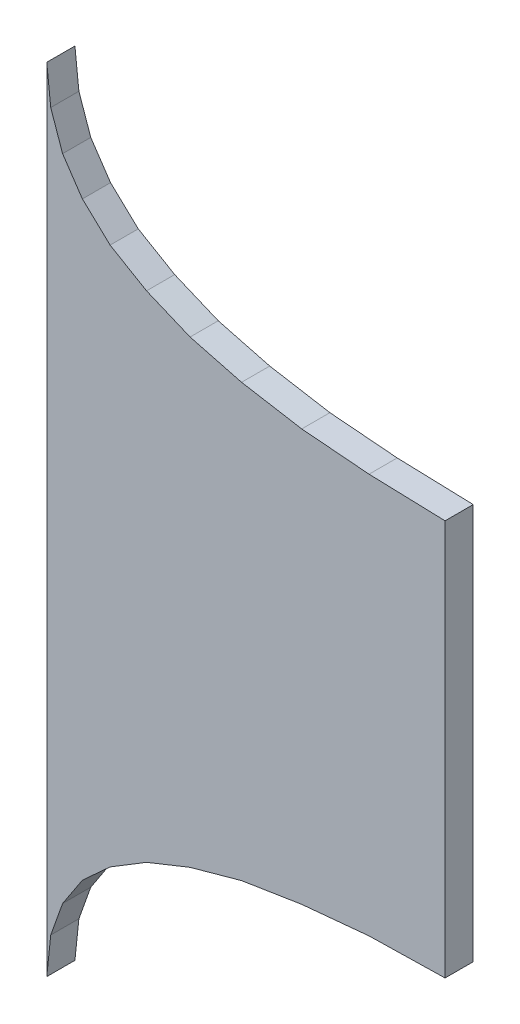
ISO-10303-21;
HEADER;
FILE_DESCRIPTION(('STEP AP214'),'2;1');
FILE_NAME('part.step','',(''),(''),'','','');
FILE_SCHEMA(('AUTOMOTIVE_DESIGN { 1 0 10303 214 1 1 1 1 }'));
ENDSEC;
DATA;
#1=APPLICATION_CONTEXT('core data for automotive mechanical design processes');
#2=APPLICATION_PROTOCOL_DEFINITION('international standard','automotive_design',2000,#1);
#3=PRODUCT_CONTEXT('',#1,'mechanical');
#4=PRODUCT('Part','Part','',(#3));
#5=PRODUCT_RELATED_PRODUCT_CATEGORY('part','',(#4));
#6=PRODUCT_DEFINITION_FORMATION('','',#4);
#7=PRODUCT_DEFINITION_CONTEXT('part definition',#1,'design');
#8=PRODUCT_DEFINITION('design','',#6,#7);
#9=PRODUCT_DEFINITION_SHAPE('','',#8);
#10=(LENGTH_UNIT() NAMED_UNIT(*) SI_UNIT(.MILLI.,.METRE.));
#11=(NAMED_UNIT(*) PLANE_ANGLE_UNIT() SI_UNIT($,.RADIAN.));
#12=(NAMED_UNIT(*) SI_UNIT($,.STERADIAN.) SOLID_ANGLE_UNIT());
#13=UNCERTAINTY_MEASURE_WITH_UNIT(LENGTH_MEASURE(1.E-05),#10,'distance_accuracy_value','');
#14=(GEOMETRIC_REPRESENTATION_CONTEXT(3) GLOBAL_UNCERTAINTY_ASSIGNED_CONTEXT((#13)) GLOBAL_UNIT_ASSIGNED_CONTEXT((#10,
#11,#12)) REPRESENTATION_CONTEXT('',''));
#15=CARTESIAN_POINT('',(0.,0.,0.));
#16=DIRECTION('',(0.,0.,1.));
#17=DIRECTION('',(1.,0.,0.));
#18=AXIS2_PLACEMENT_3D('',#15,#16,#17);
#19=CARTESIAN_POINT('',(37.2039985656738,68.6500015258789,0.));
#20=DIRECTION('',(-0.0312186325311308,-0.99951257970217,0.));
#21=DIRECTION('',(-0.99951257970217,0.0312186325311308,0.));
#22=AXIS2_PLACEMENT_3D('',#19,#20,#21);
#23=PLANE('',#22);
#24=DIRECTION('',(-0.99951257970217,0.0312186325311308,0.));
#25=VECTOR('',#24,1.);
#26=CARTESIAN_POINT('',(37.2039985656738,68.6500015258789,0.03556));
#27=LINE('',#26,#25);
#28=CARTESIAN_POINT('',(37.2039985656738,68.6500015258789,0.03556));
#29=VERTEX_POINT('',#28);
#30=CARTESIAN_POINT('',(37.1080017089844,68.6529998779297,0.03556));
#31=VERTEX_POINT('',#30);
#32=EDGE_CURVE('E11',#29,#31,#27,.T.);
#33=ORIENTED_EDGE('',*,*,#32,.F.);
#34=DIRECTION('',(0.,0.,1.));
#35=VECTOR('',#34,1.);
#36=CARTESIAN_POINT('',(37.2039985656738,68.6500015258789,0.));
#37=LINE('',#36,#35);
#38=CARTESIAN_POINT('',(37.2039985656738,68.6500015258789,0.));
#39=VERTEX_POINT('',#38);
#40=EDGE_CURVE('E24',#39,#29,#37,.T.);
#41=ORIENTED_EDGE('',*,*,#40,.F.);
#42=DIRECTION('',(-0.99951257970217,0.0312186325311308,0.));
#43=VECTOR('',#42,1.);
#44=CARTESIAN_POINT('',(37.2039985656738,68.6500015258789,0.));
#45=LINE('',#44,#43);
#46=CARTESIAN_POINT('',(37.1080017089844,68.6529998779297,0.));
#47=VERTEX_POINT('',#46);
#48=EDGE_CURVE('E184',#39,#47,#45,.T.);
#49=ORIENTED_EDGE('',*,*,#48,.T.);
#50=DIRECTION('',(0.,0.,1.));
#51=VECTOR('',#50,1.);
#52=CARTESIAN_POINT('',(37.1080017089844,68.6529998779297,0.));
#53=LINE('',#52,#51);
#54=EDGE_CURVE('E37',#47,#31,#53,.T.);
#55=ORIENTED_EDGE('',*,*,#54,.T.);
#56=EDGE_LOOP('',(#33,#41,#49,#55));
#57=FACE_BOUND('',#56,.T.);
#58=ADVANCED_FACE('F17',(#57),#23,.F.);
#59=CARTESIAN_POINT('',(37.1080017089844,68.6529998779297,0.));
#60=DIRECTION('',(-0.0821163830411665,-0.996622746898864,0.));
#61=DIRECTION('',(-0.996622746898864,0.0821163830411665,0.));
#62=AXIS2_PLACEMENT_3D('',#59,#60,#61);
#63=PLANE('',#62);
#64=DIRECTION('',(-0.996622746898864,0.0821163830411665,0.));
#65=VECTOR('',#64,1.);
#66=CARTESIAN_POINT('',(37.1080017089844,68.6529998779297,0.03556));
#67=LINE('',#66,#65);
#68=CARTESIAN_POINT('',(37.0229988098144,68.6600036621094,0.03556));
#69=VERTEX_POINT('',#68);
#70=EDGE_CURVE('E336',#31,#69,#67,.T.);
#71=ORIENTED_EDGE('',*,*,#70,.F.);
#72=ORIENTED_EDGE('',*,*,#54,.F.);
#73=DIRECTION('',(-0.996622746898864,0.0821163830411665,0.));
#74=VECTOR('',#73,1.);
#75=CARTESIAN_POINT('',(37.1080017089844,68.6529998779297,0.));
#76=LINE('',#75,#74);
#77=CARTESIAN_POINT('',(37.0229988098144,68.6600036621094,0.));
#78=VERTEX_POINT('',#77);
#79=EDGE_CURVE('E333',#47,#78,#76,.T.);
#80=ORIENTED_EDGE('',*,*,#79,.T.);
#81=DIRECTION('',(0.,0.,1.));
#82=VECTOR('',#81,1.);
#83=CARTESIAN_POINT('',(37.0229988098144,68.6600036621094,0.));
#84=LINE('',#83,#82);
#85=EDGE_CURVE('E331',#78,#69,#84,.T.);
#86=ORIENTED_EDGE('',*,*,#85,.T.);
#87=EDGE_LOOP('',(#71,#72,#80,#86));
#88=FACE_BOUND('',#87,.T.);
#89=ADVANCED_FACE('F344',(#88),#63,.F.);
#90=CARTESIAN_POINT('',(37.0229988098144,68.6600036621094,0.));
#91=DIRECTION('',(-0.168513378631636,-0.985699366552577,0.));
#92=DIRECTION('',(-0.985699366552577,0.168513378631636,0.));
#93=AXIS2_PLACEMENT_3D('',#90,#91,#92);
#94=PLANE('',#93);
#95=DIRECTION('',(-0.985699366552577,0.168513378631636,0.));
#96=VECTOR('',#95,1.);
#97=CARTESIAN_POINT('',(37.0229988098144,68.6600036621094,0.03556));
#98=LINE('',#97,#96);
#99=CARTESIAN_POINT('',(36.9469985961914,68.6729965209961,0.03556));
#100=VERTEX_POINT('',#99);
#101=EDGE_CURVE('E328',#69,#100,#98,.T.);
#102=ORIENTED_EDGE('',*,*,#101,.F.);
#103=ORIENTED_EDGE('',*,*,#85,.F.);
#104=DIRECTION('',(-0.985699366552577,0.168513378631636,0.));
#105=VECTOR('',#104,1.);
#106=CARTESIAN_POINT('',(37.0229988098144,68.6600036621094,0.));
#107=LINE('',#106,#105);
#108=CARTESIAN_POINT('',(36.9469985961914,68.6729965209961,0.));
#109=VERTEX_POINT('',#108);
#110=EDGE_CURVE('E325',#78,#109,#107,.T.);
#111=ORIENTED_EDGE('',*,*,#110,.T.);
#112=DIRECTION('',(0.,0.,1.));
#113=VECTOR('',#112,1.);
#114=CARTESIAN_POINT('',(36.9469985961914,68.6729965209961,0.));
#115=LINE('',#114,#113);
#116=EDGE_CURVE('E323',#109,#100,#115,.T.);
#117=ORIENTED_EDGE('',*,*,#116,.T.);
#118=EDGE_LOOP('',(#102,#103,#111,#117));
#119=FACE_BOUND('',#118,.T.);
#120=ADVANCED_FACE('F350',(#119),#94,.F.);
#121=CARTESIAN_POINT('',(36.9469985961914,68.6729965209961,0.));
#122=DIRECTION('',(-0.253115224368057,-0.967436139077463,0.));
#123=DIRECTION('',(-0.967436139077463,0.253115224368057,0.));
#124=AXIS2_PLACEMENT_3D('',#121,#122,#123);
#125=PLANE('',#124);
#126=DIRECTION('',(-0.967436139077463,0.253115224368057,0.));
#127=VECTOR('',#126,1.);
#128=CARTESIAN_POINT('',(36.9469985961914,68.6729965209961,0.03556));
#129=LINE('',#128,#127);
#130=CARTESIAN_POINT('',(36.8819999694824,68.6900024414063,0.03556));
#131=VERTEX_POINT('',#130);
#132=EDGE_CURVE('E320',#100,#131,#129,.T.);
#133=ORIENTED_EDGE('',*,*,#132,.F.);
#134=ORIENTED_EDGE('',*,*,#116,.F.);
#135=DIRECTION('',(-0.967436139077463,0.253115224368057,0.));
#136=VECTOR('',#135,1.);
#137=CARTESIAN_POINT('',(36.9469985961914,68.6729965209961,0.));
#138=LINE('',#137,#136);
#139=CARTESIAN_POINT('',(36.8819999694824,68.6900024414063,0.));
#140=VERTEX_POINT('',#139);
#141=EDGE_CURVE('E317',#109,#140,#138,.T.);
#142=ORIENTED_EDGE('',*,*,#141,.T.);
#143=DIRECTION('',(0.,0.,1.));
#144=VECTOR('',#143,1.);
#145=CARTESIAN_POINT('',(36.8819999694824,68.6900024414063,0.));
#146=LINE('',#145,#144);
#147=EDGE_CURVE('E315',#140,#131,#146,.T.);
#148=ORIENTED_EDGE('',*,*,#147,.T.);
#149=EDGE_LOOP('',(#133,#134,#142,#148));
#150=FACE_BOUND('',#149,.T.);
#151=ADVANCED_FACE('F352',(#150),#125,.F.);
#152=CARTESIAN_POINT('',(36.8819999694824,68.6900024414063,0.));
#153=DIRECTION('',(-0.385732848397657,-0.922610518944495,0.));
#154=DIRECTION('',(-0.922610518944495,0.385732848397657,0.));
#155=AXIS2_PLACEMENT_3D('',#152,#153,#154);
#156=PLANE('',#155);
#157=DIRECTION('',(-0.922610518944495,0.385732848397657,0.));
#158=VECTOR('',#157,1.);
#159=CARTESIAN_POINT('',(36.8819999694824,68.6900024414063,0.03556));
#160=LINE('',#159,#158);
#161=CARTESIAN_POINT('',(36.8269996643066,68.7129974365234,0.03556));
#162=VERTEX_POINT('',#161);
#163=EDGE_CURVE('E312',#131,#162,#160,.T.);
#164=ORIENTED_EDGE('',*,*,#163,.F.);
#165=ORIENTED_EDGE('',*,*,#147,.F.);
#166=DIRECTION('',(-0.922610518944495,0.385732848397657,0.));
#167=VECTOR('',#166,1.);
#168=CARTESIAN_POINT('',(36.8819999694824,68.6900024414063,0.));
#169=LINE('',#168,#167);
#170=CARTESIAN_POINT('',(36.8269996643066,68.7129974365234,0.));
#171=VERTEX_POINT('',#170);
#172=EDGE_CURVE('E309',#140,#171,#169,.T.);
#173=ORIENTED_EDGE('',*,*,#172,.T.);
#174=DIRECTION('',(0.,0.,1.));
#175=VECTOR('',#174,1.);
#176=CARTESIAN_POINT('',(36.8269996643066,68.7129974365234,0.));
#177=LINE('',#176,#175);
#178=EDGE_CURVE('E307',#171,#162,#177,.T.);
#179=ORIENTED_EDGE('',*,*,#178,.T.);
#180=EDGE_LOOP('',(#164,#165,#173,#179));
#181=FACE_BOUND('',#180,.T.);
#182=ADVANCED_FACE('F357',(#181),#156,.F.);
#183=CARTESIAN_POINT('',(36.8269996643066,68.7129974365234,0.));
#184=DIRECTION('',(-0.506194787091162,-0.862419177385182,0.));
#185=DIRECTION('',(-0.862419177385182,0.506194787091162,0.));
#186=AXIS2_PLACEMENT_3D('',#183,#184,#185);
#187=PLANE('',#186);
#188=DIRECTION('',(-0.862419177385182,0.506194787091162,0.));
#189=VECTOR('',#188,1.);
#190=CARTESIAN_POINT('',(36.8269996643066,68.7129974365234,0.03556));
#191=LINE('',#190,#189);
#192=CARTESIAN_POINT('',(36.7809982299805,68.7399978637695,0.03556));
#193=VERTEX_POINT('',#192);
#194=EDGE_CURVE('E304',#162,#193,#191,.T.);
#195=ORIENTED_EDGE('',*,*,#194,.F.);
#196=ORIENTED_EDGE('',*,*,#178,.F.);
#197=DIRECTION('',(-0.862419177385182,0.506194787091162,0.));
#198=VECTOR('',#197,1.);
#199=CARTESIAN_POINT('',(36.8269996643066,68.7129974365234,0.));
#200=LINE('',#199,#198);
#201=CARTESIAN_POINT('',(36.7809982299805,68.7399978637695,0.));
#202=VERTEX_POINT('',#201);
#203=EDGE_CURVE('E301',#171,#202,#200,.T.);
#204=ORIENTED_EDGE('',*,*,#203,.T.);
#205=DIRECTION('',(0.,0.,1.));
#206=VECTOR('',#205,1.);
#207=CARTESIAN_POINT('',(36.7809982299805,68.7399978637695,0.));
#208=LINE('',#207,#206);
#209=EDGE_CURVE('E299',#202,#193,#208,.T.);
#210=ORIENTED_EDGE('',*,*,#209,.T.);
#211=EDGE_LOOP('',(#195,#196,#204,#210));
#212=FACE_BOUND('',#211,.T.);
#213=ADVANCED_FACE('F360',(#212),#187,.F.);
#214=CARTESIAN_POINT('',(36.7809982299805,68.7399978637695,0.));
#215=DIRECTION('',(-0.686066838628744,-0.727538516460786,0.));
#216=DIRECTION('',(-0.727538516460786,0.686066838628744,0.));
#217=AXIS2_PLACEMENT_3D('',#214,#215,#216);
#218=PLANE('',#217);
#219=DIRECTION('',(-0.727538516460786,0.686066838628744,0.));
#220=VECTOR('',#219,1.);
#221=CARTESIAN_POINT('',(36.7809982299805,68.7399978637695,0.03556));
#222=LINE('',#221,#220);
#223=CARTESIAN_POINT('',(36.7459983825684,68.7730026245117,0.03556));
#224=VERTEX_POINT('',#223);
#225=EDGE_CURVE('E296',#193,#224,#222,.T.);
#226=ORIENTED_EDGE('',*,*,#225,.F.);
#227=ORIENTED_EDGE('',*,*,#209,.F.);
#228=DIRECTION('',(-0.727538516460786,0.686066838628744,0.));
#229=VECTOR('',#228,1.);
#230=CARTESIAN_POINT('',(36.7809982299805,68.7399978637695,0.));
#231=LINE('',#230,#229);
#232=CARTESIAN_POINT('',(36.7459983825684,68.7730026245117,0.));
#233=VERTEX_POINT('',#232);
#234=EDGE_CURVE('E293',#202,#233,#231,.T.);
#235=ORIENTED_EDGE('',*,*,#234,.T.);
#236=DIRECTION('',(0.,0.,1.));
#237=VECTOR('',#236,1.);
#238=CARTESIAN_POINT('',(36.7459983825684,68.7730026245117,0.));
#239=LINE('',#238,#237);
#240=EDGE_CURVE('E291',#233,#224,#239,.T.);
#241=ORIENTED_EDGE('',*,*,#240,.T.);
#242=EDGE_LOOP('',(#226,#227,#235,#241));
#243=FACE_BOUND('',#242,.T.);
#244=ADVANCED_FACE('F365',(#243),#218,.F.);
#245=CARTESIAN_POINT('',(36.7459983825684,68.7730026245117,0.));
#246=DIRECTION('',(-0.828577185441342,-0.559874850092505,0.));
#247=DIRECTION('',(-0.559874850092505,0.828577185441342,0.));
#248=AXIS2_PLACEMENT_3D('',#245,#246,#247);
#249=PLANE('',#248);
#250=DIRECTION('',(-0.559874850092505,0.828577185441342,0.));
#251=VECTOR('',#250,1.);
#252=CARTESIAN_POINT('',(36.7459983825684,68.7730026245117,0.03556));
#253=LINE('',#252,#251);
#254=CARTESIAN_POINT('',(36.7210006713867,68.8099975585938,0.03556));
#255=VERTEX_POINT('',#254);
#256=EDGE_CURVE('E288',#224,#255,#253,.T.);
#257=ORIENTED_EDGE('',*,*,#256,.F.);
#258=ORIENTED_EDGE('',*,*,#240,.F.);
#259=DIRECTION('',(-0.559874850092505,0.828577185441342,0.));
#260=VECTOR('',#259,1.);
#261=CARTESIAN_POINT('',(36.7459983825684,68.7730026245117,0.));
#262=LINE('',#261,#260);
#263=CARTESIAN_POINT('',(36.7210006713867,68.8099975585938,0.));
#264=VERTEX_POINT('',#263);
#265=EDGE_CURVE('E285',#233,#264,#262,.T.);
#266=ORIENTED_EDGE('',*,*,#265,.T.);
#267=DIRECTION('',(0.,0.,1.));
#268=VECTOR('',#267,1.);
#269=CARTESIAN_POINT('',(36.7210006713867,68.8099975585938,0.));
#270=LINE('',#269,#268);
#271=EDGE_CURVE('E283',#264,#255,#270,.T.);
#272=ORIENTED_EDGE('',*,*,#271,.T.);
#273=EDGE_LOOP('',(#257,#258,#266,#272));
#274=FACE_BOUND('',#273,.T.);
#275=ADVANCED_FACE('F368',(#274),#249,.F.);
#276=CARTESIAN_POINT('',(36.7210006713867,68.8099975585938,0.));
#277=DIRECTION('',(-0.9442026047176,-0.329365209523563,0.));
#278=DIRECTION('',(-0.329365209523563,0.9442026047176,0.));
#279=AXIS2_PLACEMENT_3D('',#276,#277,#278);
#280=PLANE('',#279);
#281=DIRECTION('',(-0.329365209523563,0.944202604717599,0.));
#282=VECTOR('',#281,1.);
#283=CARTESIAN_POINT('',(36.7210006713867,68.8099975585938,0.03556));
#284=LINE('',#283,#282);
#285=CARTESIAN_POINT('',(36.7060012817383,68.8529968261719,0.03556));
#286=VERTEX_POINT('',#285);
#287=EDGE_CURVE('E280',#255,#286,#284,.T.);
#288=ORIENTED_EDGE('',*,*,#287,.F.);
#289=ORIENTED_EDGE('',*,*,#271,.F.);
#290=DIRECTION('',(-0.329365209523563,0.944202604717599,0.));
#291=VECTOR('',#290,1.);
#292=CARTESIAN_POINT('',(36.7210006713867,68.8099975585938,0.));
#293=LINE('',#292,#291);
#294=CARTESIAN_POINT('',(36.7060012817383,68.8529968261719,0.));
#295=VERTEX_POINT('',#294);
#296=EDGE_CURVE('E277',#264,#295,#293,.T.);
#297=ORIENTED_EDGE('',*,*,#296,.T.);
#298=DIRECTION('',(0.,0.,1.));
#299=VECTOR('',#298,1.);
#300=CARTESIAN_POINT('',(36.7060012817383,68.8529968261719,0.));
#301=LINE('',#300,#299);
#302=EDGE_CURVE('E275',#295,#286,#301,.T.);
#303=ORIENTED_EDGE('',*,*,#302,.T.);
#304=EDGE_LOOP('',(#288,#289,#297,#303));
#305=FACE_BOUND('',#304,.T.);
#306=ADVANCED_FACE('F373',(#305),#280,.F.);
#307=CARTESIAN_POINT('',(36.7060012817383,68.8529968261719,0.));
#308=DIRECTION('',(-0.994387648781149,-0.105797939259218,0.));
#309=DIRECTION('',(-0.105797939259218,0.994387648781149,0.));
#310=AXIS2_PLACEMENT_3D('',#307,#308,#309);
#311=PLANE('',#310);
#312=DIRECTION('',(-0.105797939259218,0.994387648781149,0.));
#313=VECTOR('',#312,1.);
#314=CARTESIAN_POINT('',(36.7060012817383,68.8529968261719,0.03556));
#315=LINE('',#314,#313);
#316=CARTESIAN_POINT('',(36.701000213623,68.9000015258789,0.03556));
#317=VERTEX_POINT('',#316);
#318=EDGE_CURVE('E272',#286,#317,#315,.T.);
#319=ORIENTED_EDGE('',*,*,#318,.F.);
#320=ORIENTED_EDGE('',*,*,#302,.F.);
#321=DIRECTION('',(-0.105797939259218,0.994387648781149,0.));
#322=VECTOR('',#321,1.);
#323=CARTESIAN_POINT('',(36.7060012817383,68.8529968261719,0.));
#324=LINE('',#323,#322);
#325=CARTESIAN_POINT('',(36.701000213623,68.9000015258789,0.));
#326=VERTEX_POINT('',#325);
#327=EDGE_CURVE('E269',#295,#326,#324,.T.);
#328=ORIENTED_EDGE('',*,*,#327,.T.);
#329=DIRECTION('',(0.,0.,1.));
#330=VECTOR('',#329,1.);
#331=CARTESIAN_POINT('',(36.701000213623,68.9000015258789,0.));
#332=LINE('',#331,#330);
#333=EDGE_CURVE('E267',#326,#317,#332,.T.);
#334=ORIENTED_EDGE('',*,*,#333,.T.);
#335=EDGE_LOOP('',(#319,#320,#328,#334));
#336=FACE_BOUND('',#335,.T.);
#337=ADVANCED_FACE('F376',(#336),#311,.F.);
#338=CARTESIAN_POINT('',(36.701000213623,68.9000015258789,0.));
#339=DIRECTION('',(1.,0.,0.));
#340=DIRECTION('',(0.,-1.,0.));
#341=AXIS2_PLACEMENT_3D('',#338,#339,#340);
#342=PLANE('',#341);
#343=DIRECTION('',(0.,-1.,0.));
#344=VECTOR('',#343,1.);
#345=CARTESIAN_POINT('',(36.701000213623,68.9000015258789,0.03556));
#346=LINE('',#345,#344);
#347=CARTESIAN_POINT('',(36.701000213623,67.9000015258789,0.03556));
#348=VERTEX_POINT('',#347);
#349=EDGE_CURVE('E264',#317,#348,#346,.T.);
#350=ORIENTED_EDGE('',*,*,#349,.F.);
#351=ORIENTED_EDGE('',*,*,#333,.F.);
#352=DIRECTION('',(0.,-1.,0.));
#353=VECTOR('',#352,1.);
#354=CARTESIAN_POINT('',(36.701000213623,68.9000015258789,0.));
#355=LINE('',#354,#353);
#356=CARTESIAN_POINT('',(36.701000213623,67.9000015258789,0.));
#357=VERTEX_POINT('',#356);
#358=EDGE_CURVE('E261',#326,#357,#355,.T.);
#359=ORIENTED_EDGE('',*,*,#358,.T.);
#360=DIRECTION('',(0.,0.,1.));
#361=VECTOR('',#360,1.);
#362=CARTESIAN_POINT('',(36.701000213623,67.9000015258789,0.));
#363=LINE('',#362,#361);
#364=EDGE_CURVE('E259',#357,#348,#363,.T.);
#365=ORIENTED_EDGE('',*,*,#364,.T.);
#366=EDGE_LOOP('',(#350,#351,#359,#365));
#367=FACE_BOUND('',#366,.T.);
#368=ADVANCED_FACE('F381',(#367),#342,.F.);
#369=CARTESIAN_POINT('',(36.701000213623,67.9000015258789,0.));
#370=DIRECTION('',(-0.994615353688575,0.103635410005223,0.));
#371=DIRECTION('',(0.103635410005223,0.994615353688575,0.));
#372=AXIS2_PLACEMENT_3D('',#369,#370,#371);
#373=PLANE('',#372);
#374=DIRECTION('',(0.103635410005223,0.994615353688575,0.));
#375=VECTOR('',#374,1.);
#376=CARTESIAN_POINT('',(36.701000213623,67.9000015258789,0.03556));
#377=LINE('',#376,#375);
#378=CARTESIAN_POINT('',(36.7060012817383,67.947998046875,0.03556));
#379=VERTEX_POINT('',#378);
#380=EDGE_CURVE('E256',#348,#379,#377,.T.);
#381=ORIENTED_EDGE('',*,*,#380,.F.);
#382=ORIENTED_EDGE('',*,*,#364,.F.);
#383=DIRECTION('',(0.103635410005223,0.994615353688575,0.));
#384=VECTOR('',#383,1.);
#385=CARTESIAN_POINT('',(36.701000213623,67.9000015258789,0.));
#386=LINE('',#385,#384);
#387=CARTESIAN_POINT('',(36.7060012817383,67.947998046875,0.));
#388=VERTEX_POINT('',#387);
#389=EDGE_CURVE('E253',#357,#388,#386,.T.);
#390=ORIENTED_EDGE('',*,*,#389,.T.);
#391=DIRECTION('',(0.,0.,1.));
#392=VECTOR('',#391,1.);
#393=CARTESIAN_POINT('',(36.7060012817383,67.947998046875,0.));
#394=LINE('',#393,#392);
#395=EDGE_CURVE('E251',#388,#379,#394,.T.);
#396=ORIENTED_EDGE('',*,*,#395,.T.);
#397=EDGE_LOOP('',(#381,#382,#390,#396));
#398=FACE_BOUND('',#397,.T.);
#399=ADVANCED_FACE('F384',(#398),#373,.F.);
#400=CARTESIAN_POINT('',(36.7060012817383,67.947998046875,0.));
#401=DIRECTION('',(-0.941745781916799,0.336325559899805,0.));
#402=DIRECTION('',(0.336325559899805,0.941745781916799,0.));
#403=AXIS2_PLACEMENT_3D('',#400,#401,#402);
#404=PLANE('',#403);
#405=DIRECTION('',(0.336325559899805,0.941745781916799,0.));
#406=VECTOR('',#405,1.);
#407=CARTESIAN_POINT('',(36.7060012817383,67.947998046875,0.03556));
#408=LINE('',#407,#406);
#409=CARTESIAN_POINT('',(36.7210006713867,67.9899978637695,0.03556));
#410=VERTEX_POINT('',#409);
#411=EDGE_CURVE('E248',#379,#410,#408,.T.);
#412=ORIENTED_EDGE('',*,*,#411,.F.);
#413=ORIENTED_EDGE('',*,*,#395,.F.);
#414=DIRECTION('',(0.336325559899805,0.941745781916799,0.));
#415=VECTOR('',#414,1.);
#416=CARTESIAN_POINT('',(36.7060012817383,67.947998046875,0.));
#417=LINE('',#416,#415);
#418=CARTESIAN_POINT('',(36.7210006713867,67.9899978637695,0.));
#419=VERTEX_POINT('',#418);
#420=EDGE_CURVE('E245',#388,#419,#417,.T.);
#421=ORIENTED_EDGE('',*,*,#420,.T.);
#422=DIRECTION('',(0.,0.,1.));
#423=VECTOR('',#422,1.);
#424=CARTESIAN_POINT('',(36.7210006713867,67.9899978637695,0.));
#425=LINE('',#424,#423);
#426=EDGE_CURVE('E243',#419,#410,#425,.T.);
#427=ORIENTED_EDGE('',*,*,#426,.T.);
#428=EDGE_LOOP('',(#412,#413,#421,#427));
#429=FACE_BOUND('',#428,.T.);
#430=ADVANCED_FACE('F389',(#429),#404,.F.);
#431=CARTESIAN_POINT('',(36.7210006713867,67.9899978637695,0.));
#432=DIRECTION('',(-0.835453560652863,0.549561050286911,0.));
#433=DIRECTION('',(0.549561050286911,0.835453560652863,0.));
#434=AXIS2_PLACEMENT_3D('',#431,#432,#433);
#435=PLANE('',#434);
#436=DIRECTION('',(0.549561050286911,0.835453560652863,0.));
#437=VECTOR('',#436,1.);
#438=CARTESIAN_POINT('',(36.7210006713867,67.9899978637695,0.03556));
#439=LINE('',#438,#437);
#440=CARTESIAN_POINT('',(36.7459983825684,68.0279998779297,0.03556));
#441=VERTEX_POINT('',#440);
#442=EDGE_CURVE('E240',#410,#441,#439,.T.);
#443=ORIENTED_EDGE('',*,*,#442,.F.);
#444=ORIENTED_EDGE('',*,*,#426,.F.);
#445=DIRECTION('',(0.549561050286911,0.835453560652863,0.));
#446=VECTOR('',#445,1.);
#447=CARTESIAN_POINT('',(36.7210006713867,67.9899978637695,0.));
#448=LINE('',#447,#446);
#449=CARTESIAN_POINT('',(36.7459983825684,68.0279998779297,0.));
#450=VERTEX_POINT('',#449);
#451=EDGE_CURVE('E237',#419,#450,#448,.T.);
#452=ORIENTED_EDGE('',*,*,#451,.T.);
#453=DIRECTION('',(0.,0.,1.));
#454=VECTOR('',#453,1.);
#455=CARTESIAN_POINT('',(36.7459983825684,68.0279998779297,0.));
#456=LINE('',#455,#454);
#457=EDGE_CURVE('E235',#450,#441,#456,.T.);
#458=ORIENTED_EDGE('',*,*,#457,.T.);
#459=EDGE_LOOP('',(#443,#444,#452,#458));
#460=FACE_BOUND('',#459,.T.);
#461=ADVANCED_FACE('F392',(#460),#435,.F.);
#462=CARTESIAN_POINT('',(36.7459983825684,68.0279998779297,0.));
#463=DIRECTION('',(-0.674744161752577,0.738051702918442,0.));
#464=DIRECTION('',(0.738051702918442,0.674744161752577,0.));
#465=AXIS2_PLACEMENT_3D('',#462,#463,#464);
#466=PLANE('',#465);
#467=DIRECTION('',(0.738051702918442,0.674744161752577,0.));
#468=VECTOR('',#467,1.);
#469=CARTESIAN_POINT('',(36.7459983825684,68.0279998779297,0.03556));
#470=LINE('',#469,#468);
#471=CARTESIAN_POINT('',(36.7809982299805,68.0599975585938,0.03556));
#472=VERTEX_POINT('',#471);
#473=EDGE_CURVE('E232',#441,#472,#470,.T.);
#474=ORIENTED_EDGE('',*,*,#473,.F.);
#475=ORIENTED_EDGE('',*,*,#457,.F.);
#476=DIRECTION('',(0.738051702918442,0.674744161752577,0.));
#477=VECTOR('',#476,1.);
#478=CARTESIAN_POINT('',(36.7459983825684,68.0279998779297,0.));
#479=LINE('',#478,#477);
#480=CARTESIAN_POINT('',(36.7809982299805,68.0599975585938,0.));
#481=VERTEX_POINT('',#480);
#482=EDGE_CURVE('E229',#450,#481,#479,.T.);
#483=ORIENTED_EDGE('',*,*,#482,.T.);
#484=DIRECTION('',(0.,0.,1.));
#485=VECTOR('',#484,1.);
#486=CARTESIAN_POINT('',(36.7809982299805,68.0599975585938,0.));
#487=LINE('',#486,#485);
#488=EDGE_CURVE('E227',#481,#472,#487,.T.);
#489=ORIENTED_EDGE('',*,*,#488,.T.);
#490=EDGE_LOOP('',(#474,#475,#483,#489));
#491=FACE_BOUND('',#490,.T.);
#492=ADVANCED_FACE('F397',(#491),#466,.F.);
#493=CARTESIAN_POINT('',(36.7809982299805,68.0599975585938,0.));
#494=DIRECTION('',(-0.519933463636763,0.854206762669717,0.));
#495=DIRECTION('',(0.854206762669717,0.519933463636763,0.));
#496=AXIS2_PLACEMENT_3D('',#493,#494,#495);
#497=PLANE('',#496);
#498=DIRECTION('',(0.854206762669717,0.519933463636763,0.));
#499=VECTOR('',#498,1.);
#500=CARTESIAN_POINT('',(36.7809982299805,68.0599975585938,0.03556));
#501=LINE('',#500,#499);
#502=CARTESIAN_POINT('',(36.8269996643066,68.0879974365234,0.03556));
#503=VERTEX_POINT('',#502);
#504=EDGE_CURVE('E224',#472,#503,#501,.T.);
#505=ORIENTED_EDGE('',*,*,#504,.F.);
#506=ORIENTED_EDGE('',*,*,#488,.F.);
#507=DIRECTION('',(0.854206762669717,0.519933463636763,0.));
#508=VECTOR('',#507,1.);
#509=CARTESIAN_POINT('',(36.7809982299805,68.0599975585938,0.));
#510=LINE('',#509,#508);
#511=CARTESIAN_POINT('',(36.8269996643066,68.0879974365234,0.));
#512=VERTEX_POINT('',#511);
#513=EDGE_CURVE('E221',#481,#512,#510,.T.);
#514=ORIENTED_EDGE('',*,*,#513,.T.);
#515=DIRECTION('',(0.,0.,1.));
#516=VECTOR('',#515,1.);
#517=CARTESIAN_POINT('',(36.8269996643066,68.0879974365234,0.));
#518=LINE('',#517,#516);
#519=EDGE_CURVE('E219',#512,#503,#518,.T.);
#520=ORIENTED_EDGE('',*,*,#519,.T.);
#521=EDGE_LOOP('',(#505,#506,#514,#520));
#522=FACE_BOUND('',#521,.T.);
#523=ADVANCED_FACE('F400',(#522),#497,.F.);
#524=CARTESIAN_POINT('',(36.8269996643066,68.0879974365234,0.));
#525=DIRECTION('',(-0.371435086839247,0.92845892545913,0.));
#526=DIRECTION('',(0.92845892545913,0.371435086839247,0.));
#527=AXIS2_PLACEMENT_3D('',#524,#525,#526);
#528=PLANE('',#527);
#529=DIRECTION('',(0.92845892545913,0.371435086839247,0.));
#530=VECTOR('',#529,1.);
#531=CARTESIAN_POINT('',(36.8269996643066,68.0879974365234,0.03556));
#532=LINE('',#531,#530);
#533=CARTESIAN_POINT('',(36.8819999694824,68.1100006103516,0.03556));
#534=VERTEX_POINT('',#533);
#535=EDGE_CURVE('E216',#503,#534,#532,.T.);
#536=ORIENTED_EDGE('',*,*,#535,.F.);
#537=ORIENTED_EDGE('',*,*,#519,.F.);
#538=DIRECTION('',(0.92845892545913,0.371435086839247,0.));
#539=VECTOR('',#538,1.);
#540=CARTESIAN_POINT('',(36.8269996643066,68.0879974365234,0.));
#541=LINE('',#540,#539);
#542=CARTESIAN_POINT('',(36.8819999694824,68.1100006103516,0.));
#543=VERTEX_POINT('',#542);
#544=EDGE_CURVE('E213',#512,#543,#541,.T.);
#545=ORIENTED_EDGE('',*,*,#544,.T.);
#546=DIRECTION('',(0.,0.,1.));
#547=VECTOR('',#546,1.);
#548=CARTESIAN_POINT('',(36.8819999694824,68.1100006103516,0.));
#549=LINE('',#548,#547);
#550=EDGE_CURVE('E211',#543,#534,#549,.T.);
#551=ORIENTED_EDGE('',*,*,#550,.T.);
#552=EDGE_LOOP('',(#536,#537,#545,#551));
#553=FACE_BOUND('',#552,.T.);
#554=ADVANCED_FACE('F405',(#553),#528,.F.);
#555=CARTESIAN_POINT('',(36.8819999694824,68.1100006103516,0.));
#556=DIRECTION('',(-0.266853220896944,0.963737183311367,0.));
#557=DIRECTION('',(0.963737183311367,0.266853220896944,0.));
#558=AXIS2_PLACEMENT_3D('',#555,#556,#557);
#559=PLANE('',#558);
#560=DIRECTION('',(0.963737183311367,0.266853220896944,0.));
#561=VECTOR('',#560,1.);
#562=CARTESIAN_POINT('',(36.8819999694824,68.1100006103516,0.03556));
#563=LINE('',#562,#561);
#564=CARTESIAN_POINT('',(36.9469985961914,68.1279983520508,0.03556));
#565=VERTEX_POINT('',#564);
#566=EDGE_CURVE('E208',#534,#565,#563,.T.);
#567=ORIENTED_EDGE('',*,*,#566,.F.);
#568=ORIENTED_EDGE('',*,*,#550,.F.);
#569=DIRECTION('',(0.963737183311367,0.266853220896944,0.));
#570=VECTOR('',#569,1.);
#571=CARTESIAN_POINT('',(36.8819999694824,68.1100006103516,0.));
#572=LINE('',#571,#570);
#573=CARTESIAN_POINT('',(36.9469985961914,68.1279983520508,0.));
#574=VERTEX_POINT('',#573);
#575=EDGE_CURVE('E205',#543,#574,#572,.T.);
#576=ORIENTED_EDGE('',*,*,#575,.T.);
#577=DIRECTION('',(0.,0.,1.));
#578=VECTOR('',#577,1.);
#579=CARTESIAN_POINT('',(36.9469985961914,68.1279983520508,0.));
#580=LINE('',#579,#578);
#581=EDGE_CURVE('E203',#574,#565,#580,.T.);
#582=ORIENTED_EDGE('',*,*,#581,.T.);
#583=EDGE_LOOP('',(#567,#568,#576,#582));
#584=FACE_BOUND('',#583,.T.);
#585=ADVANCED_FACE('F408',(#584),#559,.F.);
#586=CARTESIAN_POINT('',(36.9469985961914,68.1279983520508,0.));
#587=DIRECTION('',(-0.155975303184465,0.987760955290557,0.));
#588=DIRECTION('',(0.987760955290557,0.155975303184465,0.));
#589=AXIS2_PLACEMENT_3D('',#586,#587,#588);
#590=PLANE('',#589);
#591=DIRECTION('',(0.987760955290557,0.155975303184465,0.));
#592=VECTOR('',#591,1.);
#593=CARTESIAN_POINT('',(36.9469985961914,68.1279983520508,0.03556));
#594=LINE('',#593,#592);
#595=CARTESIAN_POINT('',(37.0229988098144,68.1399993896484,0.03556));
#596=VERTEX_POINT('',#595);
#597=EDGE_CURVE('E200',#565,#596,#594,.T.);
#598=ORIENTED_EDGE('',*,*,#597,.F.);
#599=ORIENTED_EDGE('',*,*,#581,.F.);
#600=DIRECTION('',(0.987760955290557,0.155975303184465,0.));
#601=VECTOR('',#600,1.);
#602=CARTESIAN_POINT('',(36.9469985961914,68.1279983520508,0.));
#603=LINE('',#602,#601);
#604=CARTESIAN_POINT('',(37.0229988098144,68.1399993896484,0.));
#605=VERTEX_POINT('',#604);
#606=EDGE_CURVE('E197',#574,#605,#603,.T.);
#607=ORIENTED_EDGE('',*,*,#606,.T.);
#608=DIRECTION('',(0.,0.,1.));
#609=VECTOR('',#608,1.);
#610=CARTESIAN_POINT('',(37.0229988098144,68.1399993896484,0.));
#611=LINE('',#610,#609);
#612=EDGE_CURVE('E195',#605,#596,#611,.T.);
#613=ORIENTED_EDGE('',*,*,#612,.T.);
#614=EDGE_LOOP('',(#598,#599,#607,#613));
#615=FACE_BOUND('',#614,.T.);
#616=ADVANCED_FACE('F413',(#615),#590,.F.);
#617=CARTESIAN_POINT('',(37.0229988098144,68.1399993896485,0.));
#618=DIRECTION('',(-0.0937379307075985,0.995596906557397,0.));
#619=DIRECTION('',(0.995596906557397,0.0937379307075985,0.));
#620=AXIS2_PLACEMENT_3D('',#617,#618,#619);
#621=PLANE('',#620);
#622=DIRECTION('',(0.995596906557396,0.0937379307075985,0.));
#623=VECTOR('',#622,1.);
#624=CARTESIAN_POINT('',(37.0229988098144,68.1399993896484,0.03556));
#625=LINE('',#624,#623);
#626=CARTESIAN_POINT('',(37.1080017089844,68.1480026245117,0.03556));
#627=VERTEX_POINT('',#626);
#628=EDGE_CURVE('E192',#596,#627,#625,.T.);
#629=ORIENTED_EDGE('',*,*,#628,.F.);
#630=ORIENTED_EDGE('',*,*,#612,.F.);
#631=DIRECTION('',(0.995596906557396,0.0937379307075985,0.));
#632=VECTOR('',#631,1.);
#633=CARTESIAN_POINT('',(37.0229988098144,68.1399993896484,0.));
#634=LINE('',#633,#632);
#635=CARTESIAN_POINT('',(37.1080017089844,68.1480026245117,0.));
#636=VERTEX_POINT('',#635);
#637=EDGE_CURVE('E190',#605,#636,#634,.T.);
#638=ORIENTED_EDGE('',*,*,#637,.T.);
#639=DIRECTION('',(0.,0.,1.));
#640=VECTOR('',#639,1.);
#641=CARTESIAN_POINT('',(37.1080017089844,68.1480026245117,0.));
#642=LINE('',#641,#640);
#643=EDGE_CURVE('E175',#636,#627,#642,.T.);
#644=ORIENTED_EDGE('',*,*,#643,.T.);
#645=EDGE_LOOP('',(#629,#630,#638,#644));
#646=FACE_BOUND('',#645,.T.);
#647=ADVANCED_FACE('F415',(#646),#621,.F.);
#648=CARTESIAN_POINT('',(37.1080017089844,68.1480026245117,0.));
#649=DIRECTION('',(-0.0208180583789891,0.999783280739046,0.));
#650=DIRECTION('',(0.999783280739046,0.0208180583789891,0.));
#651=AXIS2_PLACEMENT_3D('',#648,#649,#650);
#652=PLANE('',#651);
#653=DIRECTION('',(0.999783280739046,0.0208180583789891,0.));
#654=VECTOR('',#653,1.);
#655=CARTESIAN_POINT('',(37.1080017089844,68.1480026245117,0.03556));
#656=LINE('',#655,#654);
#657=CARTESIAN_POINT('',(37.2039985656738,68.1500015258789,0.03556));
#658=VERTEX_POINT('',#657);
#659=EDGE_CURVE('E179',#627,#658,#656,.T.);
#660=ORIENTED_EDGE('',*,*,#659,.F.);
#661=ORIENTED_EDGE('',*,*,#643,.F.);
#662=DIRECTION('',(0.999783280739046,0.0208180583789891,0.));
#663=VECTOR('',#662,1.);
#664=CARTESIAN_POINT('',(37.1080017089844,68.1480026245117,0.));
#665=LINE('',#664,#663);
#666=CARTESIAN_POINT('',(37.2039985656738,68.1500015258789,0.));
#667=VERTEX_POINT('',#666);
#668=EDGE_CURVE('E171',#636,#667,#665,.T.);
#669=ORIENTED_EDGE('',*,*,#668,.T.);
#670=DIRECTION('',(0.,0.,1.));
#671=VECTOR('',#670,1.);
#672=CARTESIAN_POINT('',(37.2039985656738,68.1500015258789,0.));
#673=LINE('',#672,#671);
#674=EDGE_CURVE('E161',#667,#658,#673,.T.);
#675=ORIENTED_EDGE('',*,*,#674,.T.);
#676=EDGE_LOOP('',(#660,#661,#669,#675));
#677=FACE_BOUND('',#676,.T.);
#678=ADVANCED_FACE('F174',(#677),#652,.F.);
#679=CARTESIAN_POINT('',(37.2039985656738,68.1500015258789,0.));
#680=DIRECTION('',(-1.,0.,0.));
#681=DIRECTION('',(0.,1.,0.));
#682=AXIS2_PLACEMENT_3D('',#679,#680,#681);
#683=PLANE('',#682);
#684=DIRECTION('',(0.,1.,0.));
#685=VECTOR('',#684,1.);
#686=CARTESIAN_POINT('',(37.2039985656738,68.1500015258789,0.03556));
#687=LINE('',#686,#685);
#688=EDGE_CURVE('E167',#658,#29,#687,.T.);
#689=ORIENTED_EDGE('',*,*,#688,.F.);
#690=ORIENTED_EDGE('',*,*,#674,.F.);
#691=DIRECTION('',(0.,1.,0.));
#692=VECTOR('',#691,1.);
#693=CARTESIAN_POINT('',(37.2039985656738,68.1500015258789,0.));
#694=LINE('',#693,#692);
#695=EDGE_CURVE('E165',#667,#39,#694,.T.);
#696=ORIENTED_EDGE('',*,*,#695,.T.);
#697=ORIENTED_EDGE('',*,*,#40,.T.);
#698=EDGE_LOOP('',(#689,#690,#696,#697));
#699=FACE_BOUND('',#698,.T.);
#700=ADVANCED_FACE('F163',(#699),#683,.F.);
#701=CARTESIAN_POINT('',(37.2039985656738,68.6500015258789,0.));
#702=DIRECTION('',(0.,0.,1.));
#703=DIRECTION('',(1.,0.,0.));
#704=AXIS2_PLACEMENT_3D('',#701,#702,#703);
#705=PLANE('',#704);
#706=ORIENTED_EDGE('',*,*,#695,.F.);
#707=ORIENTED_EDGE('',*,*,#668,.F.);
#708=ORIENTED_EDGE('',*,*,#637,.F.);
#709=ORIENTED_EDGE('',*,*,#606,.F.);
#710=ORIENTED_EDGE('',*,*,#575,.F.);
#711=ORIENTED_EDGE('',*,*,#544,.F.);
#712=ORIENTED_EDGE('',*,*,#513,.F.);
#713=ORIENTED_EDGE('',*,*,#482,.F.);
#714=ORIENTED_EDGE('',*,*,#451,.F.);
#715=ORIENTED_EDGE('',*,*,#420,.F.);
#716=ORIENTED_EDGE('',*,*,#389,.F.);
#717=ORIENTED_EDGE('',*,*,#358,.F.);
#718=ORIENTED_EDGE('',*,*,#327,.F.);
#719=ORIENTED_EDGE('',*,*,#296,.F.);
#720=ORIENTED_EDGE('',*,*,#265,.F.);
#721=ORIENTED_EDGE('',*,*,#234,.F.);
#722=ORIENTED_EDGE('',*,*,#203,.F.);
#723=ORIENTED_EDGE('',*,*,#172,.F.);
#724=ORIENTED_EDGE('',*,*,#141,.F.);
#725=ORIENTED_EDGE('',*,*,#110,.F.);
#726=ORIENTED_EDGE('',*,*,#79,.F.);
#727=ORIENTED_EDGE('',*,*,#48,.F.);
#728=EDGE_LOOP('',(#706,#707,#708,#709,#710,#711,#712,#713,#714,#715,#716,#717,#718,#719,#720,
#721,#722,#723,#724,#725,#726,#727));
#729=FACE_BOUND('',#728,.T.);
#730=ADVANCED_FACE('F182',(#729),#705,.F.);
#731=CARTESIAN_POINT('',(37.2039985656738,68.6500015258789,0.03556));
#732=DIRECTION('',(0.,0.,1.));
#733=DIRECTION('',(1.,0.,0.));
#734=AXIS2_PLACEMENT_3D('',#731,#732,#733);
#735=PLANE('',#734);
#736=ORIENTED_EDGE('',*,*,#32,.T.);
#737=ORIENTED_EDGE('',*,*,#70,.T.);
#738=ORIENTED_EDGE('',*,*,#101,.T.);
#739=ORIENTED_EDGE('',*,*,#132,.T.);
#740=ORIENTED_EDGE('',*,*,#163,.T.);
#741=ORIENTED_EDGE('',*,*,#194,.T.);
#742=ORIENTED_EDGE('',*,*,#225,.T.);
#743=ORIENTED_EDGE('',*,*,#256,.T.);
#744=ORIENTED_EDGE('',*,*,#287,.T.);
#745=ORIENTED_EDGE('',*,*,#318,.T.);
#746=ORIENTED_EDGE('',*,*,#349,.T.);
#747=ORIENTED_EDGE('',*,*,#380,.T.);
#748=ORIENTED_EDGE('',*,*,#411,.T.);
#749=ORIENTED_EDGE('',*,*,#442,.T.);
#750=ORIENTED_EDGE('',*,*,#473,.T.);
#751=ORIENTED_EDGE('',*,*,#504,.T.);
#752=ORIENTED_EDGE('',*,*,#535,.T.);
#753=ORIENTED_EDGE('',*,*,#566,.T.);
#754=ORIENTED_EDGE('',*,*,#597,.T.);
#755=ORIENTED_EDGE('',*,*,#628,.T.);
#756=ORIENTED_EDGE('',*,*,#659,.T.);
#757=ORIENTED_EDGE('',*,*,#688,.T.);
#758=EDGE_LOOP('',(#736,#737,#738,#739,#740,#741,#742,#743,#744,#745,#746,#747,#748,#749,#750,
#751,#752,#753,#754,#755,#756,#757));
#759=FACE_BOUND('',#758,.T.);
#760=ADVANCED_FACE('F347',(#759),#735,.T.);
#761=CLOSED_SHELL('',(#58,#89,#120,#151,#182,#213,#244,#275,#306,#337,#368,#399,#430,#461,#492,
#523,#554,#585,#616,#647,#678,#700,#730,#760));
#762=MANIFOLD_SOLID_BREP('B1',#761);
#763=ADVANCED_BREP_SHAPE_REPRESENTATION('',(#18,#762),#14);
#764=SHAPE_DEFINITION_REPRESENTATION(#9,#763);
ENDSEC;
END-ISO-10303-21;
